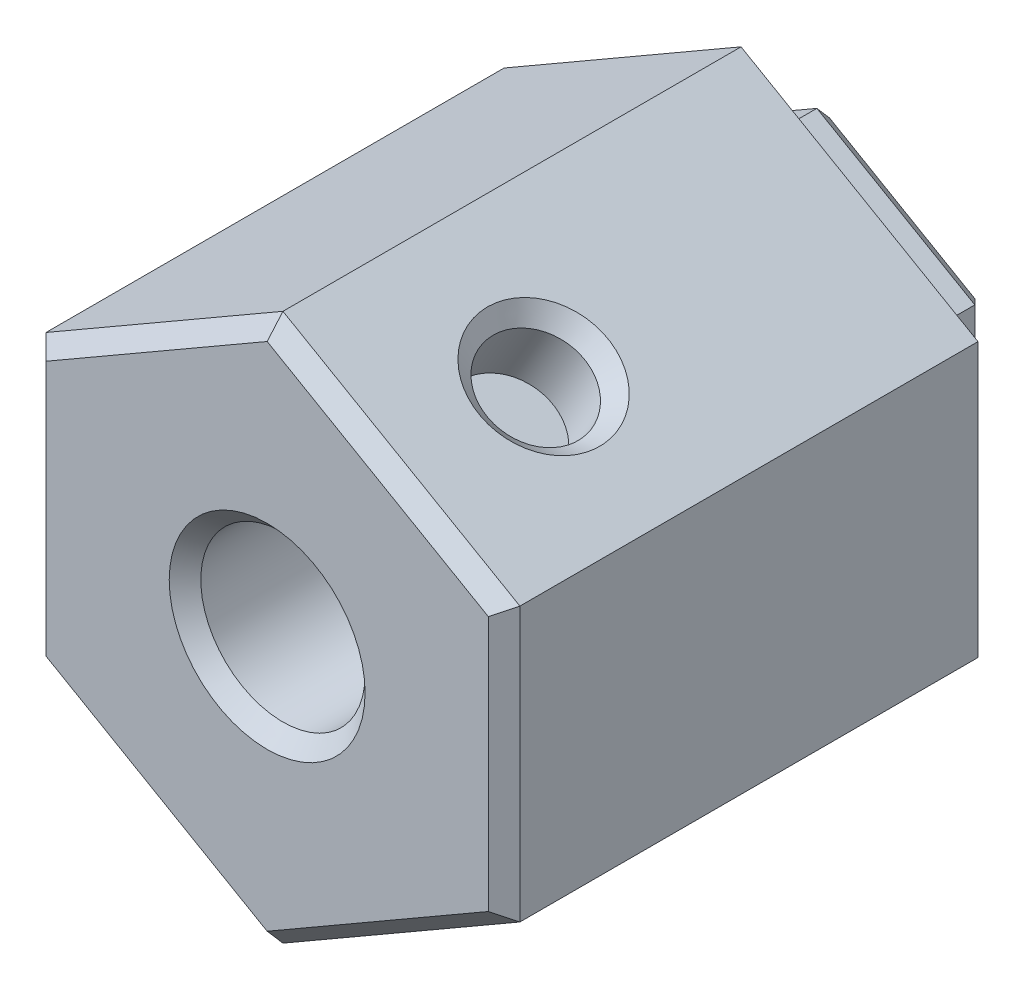
ISO-10303-21;
HEADER;
FILE_DESCRIPTION(('STEP AP214'),'2;1');
FILE_NAME('part.step','',(''),(''),'','','');
FILE_SCHEMA(('AUTOMOTIVE_DESIGN { 1 0 10303 214 1 1 1 1 }'));
ENDSEC;
DATA;
#1=APPLICATION_CONTEXT('core data for automotive mechanical design processes');
#2=APPLICATION_PROTOCOL_DEFINITION('international standard','automotive_design',2000,#1);
#3=PRODUCT_CONTEXT('',#1,'mechanical');
#4=PRODUCT('Part','Part','',(#3));
#5=PRODUCT_RELATED_PRODUCT_CATEGORY('part','',(#4));
#6=PRODUCT_DEFINITION_FORMATION('','',#4);
#7=PRODUCT_DEFINITION_CONTEXT('part definition',#1,'design');
#8=PRODUCT_DEFINITION('design','',#6,#7);
#9=PRODUCT_DEFINITION_SHAPE('','',#8);
#10=(LENGTH_UNIT() NAMED_UNIT(*) SI_UNIT(.MILLI.,.METRE.));
#11=(NAMED_UNIT(*) PLANE_ANGLE_UNIT() SI_UNIT($,.RADIAN.));
#12=(NAMED_UNIT(*) SI_UNIT($,.STERADIAN.) SOLID_ANGLE_UNIT());
#13=UNCERTAINTY_MEASURE_WITH_UNIT(LENGTH_MEASURE(1.E-05),#10,'distance_accuracy_value','');
#14=(GEOMETRIC_REPRESENTATION_CONTEXT(3) GLOBAL_UNCERTAINTY_ASSIGNED_CONTEXT((#13)) GLOBAL_UNIT_ASSIGNED_CONTEXT((#10,
#11,#12)) REPRESENTATION_CONTEXT('',''));
#15=CARTESIAN_POINT('',(0.,0.,0.));
#16=DIRECTION('',(0.,0.,1.));
#17=DIRECTION('',(1.,0.,0.));
#18=AXIS2_PLACEMENT_3D('',#15,#16,#17);
#19=CARTESIAN_POINT('',(0.,0.,0.));
#20=DIRECTION('',(0.,0.,1.));
#21=DIRECTION('',(1.,0.,0.));
#22=AXIS2_PLACEMENT_3D('',#19,#20,#21);
#23=PLANE('',#22);
#24=DIRECTION('',(-0.866025403784442,0.499999999999995,0.));
#25=VECTOR('',#24,1.);
#26=CARTESIAN_POINT('',(7.49999999999994,4.33012701892227,0.));
#27=LINE('',#26,#25);
#28=CARTESIAN_POINT('',(7.49999999999994,4.33012701892227,0.));
#29=VERTEX_POINT('',#28);
#30=CARTESIAN_POINT('',(0.,8.66025403784437,0.));
#31=VERTEX_POINT('',#30);
#32=EDGE_CURVE('E198',#29,#31,#27,.T.);
#33=ORIENTED_EDGE('',*,*,#32,.F.);
#34=DIRECTION('',(0.,1.,0.));
#35=VECTOR('',#34,1.);
#36=CARTESIAN_POINT('',(7.50000000000003,-4.33012701892212,0.));
#37=LINE('',#36,#35);
#38=CARTESIAN_POINT('',(7.50000000000003,-4.33012701892212,0.));
#39=VERTEX_POINT('',#38);
#40=EDGE_CURVE('E213',#39,#29,#37,.T.);
#41=ORIENTED_EDGE('',*,*,#40,.F.);
#42=DIRECTION('',(0.866025403784435,0.500000000000007,0.));
#43=VECTOR('',#42,1.);
#44=CARTESIAN_POINT('',(0.,-8.66025403784437,0.));
#45=LINE('',#44,#43);
#46=CARTESIAN_POINT('',(0.,-8.66025403784437,0.));
#47=VERTEX_POINT('',#46);
#48=EDGE_CURVE('E210',#47,#39,#45,.T.);
#49=ORIENTED_EDGE('',*,*,#48,.F.);
#50=DIRECTION('',(0.866025403784442,-0.499999999999995,0.));
#51=VECTOR('',#50,1.);
#52=CARTESIAN_POINT('',(-7.49999999999997,-4.33012701892222,0.));
#53=LINE('',#52,#51);
#54=CARTESIAN_POINT('',(-7.49999999999997,-4.33012701892222,0.));
#55=VERTEX_POINT('',#54);
#56=EDGE_CURVE('E207',#55,#47,#53,.T.);
#57=ORIENTED_EDGE('',*,*,#56,.F.);
#58=DIRECTION('',(0.,-1.,0.));
#59=VECTOR('',#58,1.);
#60=CARTESIAN_POINT('',(-7.5,4.33012701892217,0.));
#61=LINE('',#60,#59);
#62=CARTESIAN_POINT('',(-7.5,4.33012701892217,0.));
#63=VERTEX_POINT('',#62);
#64=EDGE_CURVE('E204',#63,#55,#61,.T.);
#65=ORIENTED_EDGE('',*,*,#64,.F.);
#66=DIRECTION('',(-0.866025403784438,-0.500000000000001,0.));
#67=VECTOR('',#66,1.);
#68=CARTESIAN_POINT('',(0.,8.66025403784437,0.));
#69=LINE('',#68,#67);
#70=EDGE_CURVE('E201',#31,#63,#69,.T.);
#71=ORIENTED_EDGE('',*,*,#70,.F.);
#72=EDGE_LOOP('',(#33,#41,#49,#57,#65,#71));
#73=FACE_BOUND('',#72,.T.);
#74=DIRECTION('',(0.866025403784439,0.5,0.));
#75=VECTOR('',#74,1.);
#76=CARTESIAN_POINT('',(-5.,2.88675134594813,0.));
#77=LINE('',#76,#75);
#78=CARTESIAN_POINT('',(-5.,2.88675134594813,0.));
#79=VERTEX_POINT('',#78);
#80=CARTESIAN_POINT('',(0.,5.77350269189626,0.));
#81=VERTEX_POINT('',#80);
#82=EDGE_CURVE('E177',#79,#81,#77,.T.);
#83=ORIENTED_EDGE('',*,*,#82,.F.);
#84=DIRECTION('',(0.,1.,0.));
#85=VECTOR('',#84,1.);
#86=CARTESIAN_POINT('',(-5.,-2.88675134594813,0.));
#87=LINE('',#86,#85);
#88=CARTESIAN_POINT('',(-5.,-2.88675134594813,0.));
#89=VERTEX_POINT('',#88);
#90=EDGE_CURVE('E187',#89,#79,#87,.T.);
#91=ORIENTED_EDGE('',*,*,#90,.F.);
#92=DIRECTION('',(-0.866025403784439,0.5,0.));
#93=VECTOR('',#92,1.);
#94=CARTESIAN_POINT('',(0.,-5.77350269189626,0.));
#95=LINE('',#94,#93);
#96=CARTESIAN_POINT('',(0.,-5.77350269189626,0.));
#97=VERTEX_POINT('',#96);
#98=EDGE_CURVE('E184',#97,#89,#95,.T.);
#99=ORIENTED_EDGE('',*,*,#98,.F.);
#100=DIRECTION('',(-0.866025403784439,-0.5,0.));
#101=VECTOR('',#100,1.);
#102=CARTESIAN_POINT('',(5.,-2.88675134594813,0.));
#103=LINE('',#102,#101);
#104=CARTESIAN_POINT('',(5.,-2.88675134594813,0.));
#105=VERTEX_POINT('',#104);
#106=EDGE_CURVE('E174',#105,#97,#103,.T.);
#107=ORIENTED_EDGE('',*,*,#106,.F.);
#108=DIRECTION('',(0.,-1.,0.));
#109=VECTOR('',#108,1.);
#110=CARTESIAN_POINT('',(5.,2.88675134594813,0.));
#111=LINE('',#110,#109);
#112=CARTESIAN_POINT('',(5.,2.88675134594813,0.));
#113=VERTEX_POINT('',#112);
#114=EDGE_CURVE('E160',#113,#105,#111,.T.);
#115=ORIENTED_EDGE('',*,*,#114,.F.);
#116=DIRECTION('',(0.866025403784439,-0.5,0.));
#117=VECTOR('',#116,1.);
#118=CARTESIAN_POINT('',(0.,5.77350269189626,0.));
#119=LINE('',#118,#117);
#120=EDGE_CURVE('E170',#81,#113,#119,.T.);
#121=ORIENTED_EDGE('',*,*,#120,.F.);
#122=EDGE_LOOP('',(#83,#91,#99,#107,#115,#121));
#123=FACE_BOUND('',#122,.T.);
#124=ADVANCED_FACE('F33',(#73,#123),#23,.F.);
#125=CARTESIAN_POINT('',(7.49999999999994,4.33012701892227,15.));
#126=DIRECTION('',(-0.499999999999995,-0.866025403784441,0.));
#127=DIRECTION('',(0.866025403784442,-0.499999999999995,0.));
#128=AXIS2_PLACEMENT_3D('',#125,#126,#127);
#129=PLANE('',#128);
#130=CARTESIAN_POINT('',(3.74999999999997,6.49519052838333,10.));
#131=DIRECTION('',(-0.499999999999995,-0.866025403784441,0.));
#132=DIRECTION('',(0.866025403784442,-0.499999999999995,0.));
#133=AXIS2_PLACEMENT_3D('',#130,#131,#132);
#134=CIRCLE('',#133,2.04999999999999);
#135=CARTESIAN_POINT('',(1.97464792224188,7.52019052838331,10.));
#136=VERTEX_POINT('',#135);
#137=EDGE_CURVE('E292',#136,#136,#134,.T.);
#138=ORIENTED_EDGE('',*,*,#137,.T.);
#139=EDGE_LOOP('',(#138));
#140=FACE_BOUND('',#139,.T.);
#141=DIRECTION('',(0.,0.,-1.));
#142=VECTOR('',#141,1.);
#143=CARTESIAN_POINT('',(0.,8.66025403784437,15.));
#144=LINE('',#143,#142);
#145=CARTESIAN_POINT('',(0.,8.66025403784437,14.5));
#146=VERTEX_POINT('',#145);
#147=EDGE_CURVE('E226',#146,#31,#144,.T.);
#148=ORIENTED_EDGE('',*,*,#147,.F.);
#149=DIRECTION('',(0.866025403784442,-0.499999999999995,0.));
#150=VECTOR('',#149,1.);
#151=CARTESIAN_POINT('',(7.49999999999994,4.33012701892227,14.5));
#152=LINE('',#151,#150);
#153=CARTESIAN_POINT('',(7.49999999999994,4.33012701892227,14.5));
#154=VERTEX_POINT('',#153);
#155=EDGE_CURVE('E255',#146,#154,#152,.T.);
#156=ORIENTED_EDGE('',*,*,#155,.T.);
#157=DIRECTION('',(0.,0.,-1.));
#158=VECTOR('',#157,1.);
#159=CARTESIAN_POINT('',(7.49999999999994,4.33012701892227,15.));
#160=LINE('',#159,#158);
#161=EDGE_CURVE('E216',#154,#29,#160,.T.);
#162=ORIENTED_EDGE('',*,*,#161,.T.);
#163=ORIENTED_EDGE('',*,*,#32,.T.);
#164=EDGE_LOOP('',(#148,#156,#162,#163));
#165=FACE_BOUND('',#164,.T.);
#166=ADVANCED_FACE('F382',(#140,#165),#129,.F.);
#167=CARTESIAN_POINT('',(0.,8.66025403784437,15.));
#168=DIRECTION('',(0.500000000000001,-0.866025403784438,0.));
#169=DIRECTION('',(0.866025403784438,0.500000000000001,0.));
#170=AXIS2_PLACEMENT_3D('',#167,#168,#169);
#171=PLANE('',#170);
#172=DIRECTION('',(0.,0.,-1.));
#173=VECTOR('',#172,1.);
#174=CARTESIAN_POINT('',(-7.5,4.33012701892217,15.));
#175=LINE('',#174,#173);
#176=CARTESIAN_POINT('',(-7.5,4.33012701892217,14.5));
#177=VERTEX_POINT('',#176);
#178=EDGE_CURVE('E224',#177,#63,#175,.T.);
#179=ORIENTED_EDGE('',*,*,#178,.F.);
#180=DIRECTION('',(0.866025403784438,0.500000000000001,0.));
#181=VECTOR('',#180,1.);
#182=CARTESIAN_POINT('',(0.,8.66025403784437,14.5));
#183=LINE('',#182,#181);
#184=EDGE_CURVE('E253',#177,#146,#183,.T.);
#185=ORIENTED_EDGE('',*,*,#184,.T.);
#186=ORIENTED_EDGE('',*,*,#147,.T.);
#187=ORIENTED_EDGE('',*,*,#70,.T.);
#188=EDGE_LOOP('',(#179,#185,#186,#187));
#189=FACE_BOUND('',#188,.T.);
#190=ADVANCED_FACE('F388',(#189),#171,.F.);
#191=CARTESIAN_POINT('',(-7.5,4.33012701892217,15.));
#192=DIRECTION('',(1.,0.,0.));
#193=DIRECTION('',(0.,1.,0.));
#194=AXIS2_PLACEMENT_3D('',#191,#192,#193);
#195=PLANE('',#194);
#196=CARTESIAN_POINT('',(-7.49999999999998,0.,10.));
#197=DIRECTION('',(1.,0.,0.));
#198=DIRECTION('',(0.,1.,0.));
#199=AXIS2_PLACEMENT_3D('',#196,#197,#198);
#200=CIRCLE('',#199,2.04999999999996);
#201=CARTESIAN_POINT('',(-7.49999999999999,2.04999999999988,10.));
#202=VERTEX_POINT('',#201);
#203=EDGE_CURVE('E280',#202,#202,#200,.T.);
#204=ORIENTED_EDGE('',*,*,#203,.T.);
#205=EDGE_LOOP('',(#204));
#206=FACE_BOUND('',#205,.T.);
#207=DIRECTION('',(0.,0.,-1.));
#208=VECTOR('',#207,1.);
#209=CARTESIAN_POINT('',(-7.49999999999997,-4.33012701892222,15.));
#210=LINE('',#209,#208);
#211=CARTESIAN_POINT('',(-7.49999999999997,-4.33012701892222,14.5));
#212=VERTEX_POINT('',#211);
#213=EDGE_CURVE('E222',#212,#55,#210,.T.);
#214=ORIENTED_EDGE('',*,*,#213,.F.);
#215=DIRECTION('',(0.,1.,0.));
#216=VECTOR('',#215,1.);
#217=CARTESIAN_POINT('',(-7.5,4.33012701892217,14.5));
#218=LINE('',#217,#216);
#219=EDGE_CURVE('E251',#212,#177,#218,.T.);
#220=ORIENTED_EDGE('',*,*,#219,.T.);
#221=ORIENTED_EDGE('',*,*,#178,.T.);
#222=ORIENTED_EDGE('',*,*,#64,.T.);
#223=EDGE_LOOP('',(#214,#220,#221,#222));
#224=FACE_BOUND('',#223,.T.);
#225=ADVANCED_FACE('F407',(#206,#224),#195,.F.);
#226=CARTESIAN_POINT('',(-7.49999999999997,-4.33012701892222,15.));
#227=DIRECTION('',(0.499999999999995,0.866025403784442,0.));
#228=DIRECTION('',(-0.866025403784442,0.499999999999995,0.));
#229=AXIS2_PLACEMENT_3D('',#226,#227,#228);
#230=PLANE('',#229);
#231=DIRECTION('',(0.,0.,-1.));
#232=VECTOR('',#231,1.);
#233=CARTESIAN_POINT('',(0.,-8.66025403784437,15.));
#234=LINE('',#233,#232);
#235=CARTESIAN_POINT('',(0.,-8.66025403784437,14.5));
#236=VERTEX_POINT('',#235);
#237=EDGE_CURVE('E220',#236,#47,#234,.T.);
#238=ORIENTED_EDGE('',*,*,#237,.F.);
#239=DIRECTION('',(-0.866025403784442,0.499999999999995,0.));
#240=VECTOR('',#239,1.);
#241=CARTESIAN_POINT('',(-7.49999999999997,-4.33012701892222,14.5));
#242=LINE('',#241,#240);
#243=EDGE_CURVE('E249',#236,#212,#242,.T.);
#244=ORIENTED_EDGE('',*,*,#243,.T.);
#245=ORIENTED_EDGE('',*,*,#213,.T.);
#246=ORIENTED_EDGE('',*,*,#56,.T.);
#247=EDGE_LOOP('',(#238,#244,#245,#246));
#248=FACE_BOUND('',#247,.T.);
#249=ADVANCED_FACE('F403',(#248),#230,.F.);
#250=CARTESIAN_POINT('',(0.,-8.66025403784437,15.));
#251=DIRECTION('',(-0.500000000000007,0.866025403784435,0.));
#252=DIRECTION('',(-0.866025403784435,-0.500000000000007,0.));
#253=AXIS2_PLACEMENT_3D('',#250,#251,#252);
#254=PLANE('',#253);
#255=CARTESIAN_POINT('',(3.75000000000009,-6.49519052838322,10.));
#256=DIRECTION('',(-0.500000000000007,0.866025403784435,0.));
#257=DIRECTION('',(-0.866025403784435,-0.500000000000007,0.));
#258=AXIS2_PLACEMENT_3D('',#255,#256,#257);
#259=CIRCLE('',#258,2.04999999999997);
#260=CARTESIAN_POINT('',(1.97464792224202,-7.52019052838322,10.));
#261=VERTEX_POINT('',#260);
#262=EDGE_CURVE('E286',#261,#261,#259,.T.);
#263=ORIENTED_EDGE('',*,*,#262,.T.);
#264=EDGE_LOOP('',(#263));
#265=FACE_BOUND('',#264,.T.);
#266=DIRECTION('',(0.,0.,-1.));
#267=VECTOR('',#266,1.);
#268=CARTESIAN_POINT('',(7.50000000000003,-4.33012701892212,15.));
#269=LINE('',#268,#267);
#270=CARTESIAN_POINT('',(7.50000000000003,-4.33012701892212,14.5));
#271=VERTEX_POINT('',#270);
#272=EDGE_CURVE('E218',#271,#39,#269,.T.);
#273=ORIENTED_EDGE('',*,*,#272,.F.);
#274=DIRECTION('',(-0.866025403784435,-0.500000000000007,0.));
#275=VECTOR('',#274,1.);
#276=CARTESIAN_POINT('',(0.,-8.66025403784437,14.5));
#277=LINE('',#276,#275);
#278=EDGE_CURVE('E247',#271,#236,#277,.T.);
#279=ORIENTED_EDGE('',*,*,#278,.T.);
#280=ORIENTED_EDGE('',*,*,#237,.T.);
#281=ORIENTED_EDGE('',*,*,#48,.T.);
#282=EDGE_LOOP('',(#273,#279,#280,#281));
#283=FACE_BOUND('',#282,.T.);
#284=ADVANCED_FACE('F399',(#265,#283),#254,.F.);
#285=CARTESIAN_POINT('',(7.50000000000003,-4.33012701892212,15.));
#286=DIRECTION('',(-1.,0.,0.));
#287=DIRECTION('',(0.,-1.,0.));
#288=AXIS2_PLACEMENT_3D('',#285,#286,#287);
#289=PLANE('',#288);
#290=ORIENTED_EDGE('',*,*,#161,.F.);
#291=DIRECTION('',(0.,-1.,0.));
#292=VECTOR('',#291,1.);
#293=CARTESIAN_POINT('',(7.50000000000003,-4.33012701892212,14.5));
#294=LINE('',#293,#292);
#295=EDGE_CURVE('E244',#154,#271,#294,.T.);
#296=ORIENTED_EDGE('',*,*,#295,.T.);
#297=ORIENTED_EDGE('',*,*,#272,.T.);
#298=ORIENTED_EDGE('',*,*,#40,.T.);
#299=EDGE_LOOP('',(#290,#296,#297,#298));
#300=FACE_BOUND('',#299,.T.);
#301=ADVANCED_FACE('F396',(#300),#289,.F.);
#302=CARTESIAN_POINT('',(0.,0.,15.));
#303=DIRECTION('',(0.,0.,1.));
#304=DIRECTION('',(1.,0.,0.));
#305=AXIS2_PLACEMENT_3D('',#302,#303,#304);
#306=PLANE('',#305);
#307=DIRECTION('',(0.866025403784435,0.500000000000007,0.));
#308=VECTOR('',#307,1.);
#309=CARTESIAN_POINT('',(7.25000000000002,-3.8971143170299,15.));
#310=LINE('',#309,#308);
#311=CARTESIAN_POINT('',(0.,-8.08290376865474,15.));
#312=VERTEX_POINT('',#311);
#313=CARTESIAN_POINT('',(7.00000000000002,-4.04145188432731,15.));
#314=VERTEX_POINT('',#313);
#315=EDGE_CURVE('E239',#312,#314,#310,.T.);
#316=ORIENTED_EDGE('',*,*,#315,.T.);
#317=DIRECTION('',(0.,1.,0.));
#318=VECTOR('',#317,1.);
#319=CARTESIAN_POINT('',(6.99999999999993,4.33012701892227,15.));
#320=LINE('',#319,#318);
#321=CARTESIAN_POINT('',(6.99999999999994,4.04145188432746,15.));
#322=VERTEX_POINT('',#321);
#323=EDGE_CURVE('E241',#314,#322,#320,.T.);
#324=ORIENTED_EDGE('',*,*,#323,.T.);
#325=DIRECTION('',(-0.866025403784442,0.499999999999995,0.));
#326=VECTOR('',#325,1.);
#327=CARTESIAN_POINT('',(-0.249999999999999,8.22724133595215,15.));
#328=LINE('',#327,#326);
#329=CARTESIAN_POINT('',(0.,8.08290376865475,15.));
#330=VERTEX_POINT('',#329);
#331=EDGE_CURVE('E231',#322,#330,#328,.T.);
#332=ORIENTED_EDGE('',*,*,#331,.T.);
#333=DIRECTION('',(-0.866025403784438,-0.500000000000001,0.));
#334=VECTOR('',#333,1.);
#335=CARTESIAN_POINT('',(-7.25,3.89711431702995,15.));
#336=LINE('',#335,#334);
#337=CARTESIAN_POINT('',(-6.99999999999999,4.04145188432735,15.));
#338=VERTEX_POINT('',#337);
#339=EDGE_CURVE('E233',#330,#338,#336,.T.);
#340=ORIENTED_EDGE('',*,*,#339,.T.);
#341=DIRECTION('',(0.,-1.,0.));
#342=VECTOR('',#341,1.);
#343=CARTESIAN_POINT('',(-6.99999999999996,-4.33012701892222,15.));
#344=LINE('',#343,#342);
#345=CARTESIAN_POINT('',(-6.99999999999997,-4.0414518843274,15.));
#346=VERTEX_POINT('',#345);
#347=EDGE_CURVE('E235',#338,#346,#344,.T.);
#348=ORIENTED_EDGE('',*,*,#347,.T.);
#349=DIRECTION('',(0.866025403784442,-0.499999999999995,0.));
#350=VECTOR('',#349,1.);
#351=CARTESIAN_POINT('',(0.25000000000006,-8.22724133595215,15.));
#352=LINE('',#351,#350);
#353=EDGE_CURVE('E237',#346,#312,#352,.T.);
#354=ORIENTED_EDGE('',*,*,#353,.T.);
#355=EDGE_LOOP('',(#316,#324,#332,#340,#348,#354));
#356=FACE_BOUND('',#355,.T.);
#357=CARTESIAN_POINT('',(0.,0.,15.));
#358=DIRECTION('',(0.,0.,1.));
#359=DIRECTION('',(1.,0.,0.));
#360=AXIS2_PLACEMENT_3D('',#357,#358,#359);
#361=CIRCLE('',#360,3.1);
#362=CARTESIAN_POINT('',(3.1,0.,15.));
#363=VERTEX_POINT('',#362);
#364=EDGE_CURVE('E228',#363,#363,#361,.F.);
#365=ORIENTED_EDGE('',*,*,#364,.T.);
#366=EDGE_LOOP('',(#365));
#367=FACE_BOUND('',#366,.T.);
#368=ADVANCED_FACE('F394',(#356,#367),#306,.T.);
#369=CARTESIAN_POINT('',(-5.,2.88675134594813,-2.8));
#370=DIRECTION('',(0.5,-0.866025403784439,0.));
#371=DIRECTION('',(0.866025403784439,0.5,0.));
#372=AXIS2_PLACEMENT_3D('',#369,#370,#371);
#373=PLANE('',#372);
#374=DIRECTION('',(0.,0.,1.));
#375=VECTOR('',#374,1.);
#376=CARTESIAN_POINT('',(0.,5.77350269189626,-2.8));
#377=LINE('',#376,#375);
#378=CARTESIAN_POINT('',(0.,5.77350269189626,-2.4));
#379=VERTEX_POINT('',#378);
#380=EDGE_CURVE('E163',#379,#81,#377,.T.);
#381=ORIENTED_EDGE('',*,*,#380,.F.);
#382=DIRECTION('',(-0.866025403784439,-0.5,0.));
#383=VECTOR('',#382,1.);
#384=CARTESIAN_POINT('',(-5.,2.88675134594813,-2.4));
#385=LINE('',#384,#383);
#386=CARTESIAN_POINT('',(-5.,2.88675134594813,-2.4));
#387=VERTEX_POINT('',#386);
#388=EDGE_CURVE('E11',#379,#387,#385,.T.);
#389=ORIENTED_EDGE('',*,*,#388,.T.);
#390=DIRECTION('',(0.,0.,1.));
#391=VECTOR('',#390,1.);
#392=CARTESIAN_POINT('',(-5.,2.88675134594813,-2.8));
#393=LINE('',#392,#391);
#394=EDGE_CURVE('E190',#387,#79,#393,.T.);
#395=ORIENTED_EDGE('',*,*,#394,.T.);
#396=ORIENTED_EDGE('',*,*,#82,.T.);
#397=EDGE_LOOP('',(#381,#389,#395,#396));
#398=FACE_BOUND('',#397,.T.);
#399=ADVANCED_FACE('F354',(#398),#373,.F.);
#400=CARTESIAN_POINT('',(0.,5.77350269189626,-2.8));
#401=DIRECTION('',(-0.5,-0.866025403784438,0.));
#402=DIRECTION('',(0.866025403784439,-0.5,0.));
#403=AXIS2_PLACEMENT_3D('',#400,#401,#402);
#404=PLANE('',#403);
#405=DIRECTION('',(0.,0.,1.));
#406=VECTOR('',#405,1.);
#407=CARTESIAN_POINT('',(5.,2.88675134594813,-2.8));
#408=LINE('',#407,#406);
#409=CARTESIAN_POINT('',(5.,2.88675134594813,-2.4));
#410=VERTEX_POINT('',#409);
#411=EDGE_CURVE('E157',#410,#113,#408,.T.);
#412=ORIENTED_EDGE('',*,*,#411,.F.);
#413=DIRECTION('',(-0.866025403784439,0.5,0.));
#414=VECTOR('',#413,1.);
#415=CARTESIAN_POINT('',(0.,5.77350269189626,-2.4));
#416=LINE('',#415,#414);
#417=EDGE_CURVE('E42',#410,#379,#416,.T.);
#418=ORIENTED_EDGE('',*,*,#417,.T.);
#419=ORIENTED_EDGE('',*,*,#380,.T.);
#420=ORIENTED_EDGE('',*,*,#120,.T.);
#421=EDGE_LOOP('',(#412,#418,#419,#420));
#422=FACE_BOUND('',#421,.T.);
#423=ADVANCED_FACE('F176',(#422),#404,.F.);
#424=CARTESIAN_POINT('',(5.,2.88675134594813,-2.8));
#425=DIRECTION('',(-1.,0.,0.));
#426=DIRECTION('',(0.,-1.,0.));
#427=AXIS2_PLACEMENT_3D('',#424,#425,#426);
#428=PLANE('',#427);
#429=DIRECTION('',(0.,0.,1.));
#430=VECTOR('',#429,1.);
#431=CARTESIAN_POINT('',(5.,-2.88675134594813,-2.8));
#432=LINE('',#431,#430);
#433=CARTESIAN_POINT('',(5.,-2.88675134594813,-2.4));
#434=VERTEX_POINT('',#433);
#435=EDGE_CURVE('E164',#434,#105,#432,.T.);
#436=ORIENTED_EDGE('',*,*,#435,.F.);
#437=DIRECTION('',(0.,1.,0.));
#438=VECTOR('',#437,1.);
#439=CARTESIAN_POINT('',(5.,2.88675134594813,-2.4));
#440=LINE('',#439,#438);
#441=EDGE_CURVE('E57',#434,#410,#440,.T.);
#442=ORIENTED_EDGE('',*,*,#441,.T.);
#443=ORIENTED_EDGE('',*,*,#411,.T.);
#444=ORIENTED_EDGE('',*,*,#114,.T.);
#445=EDGE_LOOP('',(#436,#442,#443,#444));
#446=FACE_BOUND('',#445,.T.);
#447=ADVANCED_FACE('F159',(#446),#428,.F.);
#448=CARTESIAN_POINT('',(5.,-2.88675134594813,-2.8));
#449=DIRECTION('',(-0.5,0.866025403784439,0.));
#450=DIRECTION('',(-0.866025403784439,-0.5,0.));
#451=AXIS2_PLACEMENT_3D('',#448,#449,#450);
#452=PLANE('',#451);
#453=DIRECTION('',(0.,0.,1.));
#454=VECTOR('',#453,1.);
#455=CARTESIAN_POINT('',(0.,-5.77350269189626,-2.8));
#456=LINE('',#455,#454);
#457=CARTESIAN_POINT('',(0.,-5.77350269189626,-2.4));
#458=VERTEX_POINT('',#457);
#459=EDGE_CURVE('E194',#458,#97,#456,.T.);
#460=ORIENTED_EDGE('',*,*,#459,.F.);
#461=DIRECTION('',(0.866025403784439,0.5,0.));
#462=VECTOR('',#461,1.);
#463=CARTESIAN_POINT('',(5.,-2.88675134594813,-2.4));
#464=LINE('',#463,#462);
#465=EDGE_CURVE('E319',#458,#434,#464,.T.);
#466=ORIENTED_EDGE('',*,*,#465,.T.);
#467=ORIENTED_EDGE('',*,*,#435,.T.);
#468=ORIENTED_EDGE('',*,*,#106,.T.);
#469=EDGE_LOOP('',(#460,#466,#467,#468));
#470=FACE_BOUND('',#469,.T.);
#471=ADVANCED_FACE('F372',(#470),#452,.F.);
#472=CARTESIAN_POINT('',(0.,-5.77350269189626,-2.8));
#473=DIRECTION('',(0.5,0.866025403784438,0.));
#474=DIRECTION('',(-0.866025403784439,0.5,0.));
#475=AXIS2_PLACEMENT_3D('',#472,#473,#474);
#476=PLANE('',#475);
#477=DIRECTION('',(0.,0.,1.));
#478=VECTOR('',#477,1.);
#479=CARTESIAN_POINT('',(-5.,-2.88675134594813,-2.8));
#480=LINE('',#479,#478);
#481=CARTESIAN_POINT('',(-5.,-2.88675134594813,-2.4));
#482=VERTEX_POINT('',#481);
#483=EDGE_CURVE('E192',#482,#89,#480,.T.);
#484=ORIENTED_EDGE('',*,*,#483,.F.);
#485=DIRECTION('',(0.866025403784439,-0.5,0.));
#486=VECTOR('',#485,1.);
#487=CARTESIAN_POINT('',(0.,-5.77350269189626,-2.4));
#488=LINE('',#487,#486);
#489=EDGE_CURVE('E317',#482,#458,#488,.T.);
#490=ORIENTED_EDGE('',*,*,#489,.T.);
#491=ORIENTED_EDGE('',*,*,#459,.T.);
#492=ORIENTED_EDGE('',*,*,#98,.T.);
#493=EDGE_LOOP('',(#484,#490,#491,#492));
#494=FACE_BOUND('',#493,.T.);
#495=ADVANCED_FACE('F370',(#494),#476,.F.);
#496=CARTESIAN_POINT('',(-5.,-2.88675134594813,-2.8));
#497=DIRECTION('',(1.,0.,0.));
#498=DIRECTION('',(0.,1.,0.));
#499=AXIS2_PLACEMENT_3D('',#496,#497,#498);
#500=PLANE('',#499);
#501=ORIENTED_EDGE('',*,*,#394,.F.);
#502=DIRECTION('',(0.,-1.,0.));
#503=VECTOR('',#502,1.);
#504=CARTESIAN_POINT('',(-5.,-2.88675134594813,-2.4));
#505=LINE('',#504,#503);
#506=EDGE_CURVE('E314',#387,#482,#505,.T.);
#507=ORIENTED_EDGE('',*,*,#506,.T.);
#508=ORIENTED_EDGE('',*,*,#483,.T.);
#509=ORIENTED_EDGE('',*,*,#90,.T.);
#510=EDGE_LOOP('',(#501,#507,#508,#509));
#511=FACE_BOUND('',#510,.T.);
#512=ADVANCED_FACE('F357',(#511),#500,.F.);
#513=CARTESIAN_POINT('',(0.,0.,-2.8));
#514=DIRECTION('',(0.,0.,-1.));
#515=DIRECTION('',(-1.,0.,0.));
#516=AXIS2_PLACEMENT_3D('',#513,#514,#515);
#517=PLANE('',#516);
#518=DIRECTION('',(-0.866025403784439,0.5,0.));
#519=VECTOR('',#518,1.);
#520=CARTESIAN_POINT('',(-4.8,-2.54034118443435,-2.8));
#521=LINE('',#520,#519);
#522=CARTESIAN_POINT('',(0.,-5.31162247654456,-2.8));
#523=VERTEX_POINT('',#522);
#524=CARTESIAN_POINT('',(-4.6,-2.65581123827228,-2.8));
#525=VERTEX_POINT('',#524);
#526=EDGE_CURVE('E309',#523,#525,#521,.T.);
#527=ORIENTED_EDGE('',*,*,#526,.T.);
#528=DIRECTION('',(0.,1.,0.));
#529=VECTOR('',#528,1.);
#530=CARTESIAN_POINT('',(-4.6,2.88675134594813,-2.8));
#531=LINE('',#530,#529);
#532=CARTESIAN_POINT('',(-4.6,2.65581123827228,-2.8));
#533=VERTEX_POINT('',#532);
#534=EDGE_CURVE('E311',#525,#533,#531,.T.);
#535=ORIENTED_EDGE('',*,*,#534,.T.);
#536=DIRECTION('',(0.866025403784439,0.5,0.));
#537=VECTOR('',#536,1.);
#538=CARTESIAN_POINT('',(0.200000000000003,5.42709253038248,-2.8));
#539=LINE('',#538,#537);
#540=CARTESIAN_POINT('',(0.,5.31162247654455,-2.8));
#541=VERTEX_POINT('',#540);
#542=EDGE_CURVE('E301',#533,#541,#539,.T.);
#543=ORIENTED_EDGE('',*,*,#542,.T.);
#544=DIRECTION('',(0.866025403784439,-0.5,0.));
#545=VECTOR('',#544,1.);
#546=CARTESIAN_POINT('',(4.8,2.54034118443435,-2.8));
#547=LINE('',#546,#545);
#548=CARTESIAN_POINT('',(4.6,2.65581123827228,-2.8));
#549=VERTEX_POINT('',#548);
#550=EDGE_CURVE('E303',#541,#549,#547,.T.);
#551=ORIENTED_EDGE('',*,*,#550,.T.);
#552=DIRECTION('',(0.,-1.,0.));
#553=VECTOR('',#552,1.);
#554=CARTESIAN_POINT('',(4.6,-2.88675134594813,-2.8));
#555=LINE('',#554,#553);
#556=CARTESIAN_POINT('',(4.6,-2.65581123827228,-2.8));
#557=VERTEX_POINT('',#556);
#558=EDGE_CURVE('E305',#549,#557,#555,.T.);
#559=ORIENTED_EDGE('',*,*,#558,.T.);
#560=DIRECTION('',(-0.866025403784439,-0.5,0.));
#561=VECTOR('',#560,1.);
#562=CARTESIAN_POINT('',(-0.200000000000003,-5.42709253038248,-2.8));
#563=LINE('',#562,#561);
#564=EDGE_CURVE('E307',#557,#523,#563,.T.);
#565=ORIENTED_EDGE('',*,*,#564,.T.);
#566=EDGE_LOOP('',(#527,#535,#543,#551,#559,#565));
#567=FACE_BOUND('',#566,.T.);
#568=CARTESIAN_POINT('',(0.,0.,-2.8));
#569=DIRECTION('',(0.,0.,-1.));
#570=DIRECTION('',(-1.,0.,0.));
#571=AXIS2_PLACEMENT_3D('',#568,#569,#570);
#572=CIRCLE('',#571,3.6);
#573=CARTESIAN_POINT('',(-3.6,0.,-2.8));
#574=VERTEX_POINT('',#573);
#575=EDGE_CURVE('E295',#574,#574,#572,.F.);
#576=ORIENTED_EDGE('',*,*,#575,.T.);
#577=EDGE_LOOP('',(#576));
#578=FACE_BOUND('',#577,.T.);
#579=ADVANCED_FACE('F577',(#567,#578),#517,.T.);
#580=CARTESIAN_POINT('',(0.,0.,-2.8));
#581=DIRECTION('',(0.,0.,1.));
#582=DIRECTION('',(1.,0.,0.));
#583=AXIS2_PLACEMENT_3D('',#580,#581,#582);
#584=CYLINDRICAL_SURFACE('',#583,2.6);
#585=CARTESIAN_POINT('',(0.,0.,-1.8));
#586=DIRECTION('',(0.,0.,-1.));
#587=DIRECTION('',(-1.,0.,0.));
#588=AXIS2_PLACEMENT_3D('',#585,#586,#587);
#589=CIRCLE('',#588,2.6);
#590=CARTESIAN_POINT('',(-2.6,0.,-1.8));
#591=VERTEX_POINT('',#590);
#592=EDGE_CURVE('E298',#591,#591,#589,.T.);
#593=ORIENTED_EDGE('',*,*,#592,.T.);
#594=EDGE_LOOP('',(#593));
#595=FACE_BOUND('',#594,.T.);
#596=CARTESIAN_POINT('',(0.,0.,14.5));
#597=DIRECTION('',(0.,0.,1.));
#598=DIRECTION('',(1.,0.,0.));
#599=AXIS2_PLACEMENT_3D('',#596,#597,#598);
#600=CIRCLE('',#599,2.6);
#601=CARTESIAN_POINT('',(2.6,0.,14.5));
#602=VERTEX_POINT('',#601);
#603=EDGE_CURVE('E257',#602,#602,#600,.T.);
#604=ORIENTED_EDGE('',*,*,#603,.T.);
#605=EDGE_LOOP('',(#604));
#606=FACE_BOUND('',#605,.T.);
#607=ADVANCED_FACE('F569',(#595,#606),#584,.F.);
#608=CARTESIAN_POINT('',(2.49999999999998,4.33012701892222,10.));
#609=DIRECTION('',(0.499999999999995,0.866025403784442,0.));
#610=DIRECTION('',(-0.866025403784442,0.499999999999995,0.));
#611=AXIS2_PLACEMENT_3D('',#608,#609,#610);
#612=CYLINDRICAL_SURFACE('',#611,1.55);
#613=CARTESIAN_POINT('',(3.49999999999998,6.06217782649112,10.));
#614=DIRECTION('',(-0.499999999999995,-0.866025403784441,0.));
#615=DIRECTION('',(0.866025403784442,-0.499999999999995,0.));
#616=AXIS2_PLACEMENT_3D('',#613,#614,#615);
#617=CIRCLE('',#616,1.55);
#618=CARTESIAN_POINT('',(2.1576606241341,6.83717782649111,10.));
#619=VERTEX_POINT('',#618);
#620=EDGE_CURVE('E289',#619,#619,#617,.F.);
#621=ORIENTED_EDGE('',*,*,#620,.T.);
#622=EDGE_LOOP('',(#621));
#623=FACE_BOUND('',#622,.T.);
#624=CARTESIAN_POINT('',(2.49999999999998,4.33012701892222,10.));
#625=DIRECTION('',(0.499999999999995,0.866025403784442,0.));
#626=DIRECTION('',(-0.866025403784442,0.499999999999995,0.));
#627=AXIS2_PLACEMENT_3D('',#624,#625,#626);
#628=CIRCLE('',#627,1.55);
#629=CARTESIAN_POINT('',(1.1576606241341,5.10512701892221,10.));
#630=VERTEX_POINT('',#629);
#631=EDGE_CURVE('E179',#630,#630,#628,.T.);
#632=ORIENTED_EDGE('',*,*,#631,.F.);
#633=EDGE_LOOP('',(#632));
#634=FACE_BOUND('',#633,.T.);
#635=ADVANCED_FACE('F562',(#623,#634),#612,.F.);
#636=CARTESIAN_POINT('',(2.49999999999998,4.33012701892222,10.));
#637=DIRECTION('',(0.499999999999995,0.866025403784442,0.));
#638=DIRECTION('',(-0.866025403784442,0.499999999999995,0.));
#639=AXIS2_PLACEMENT_3D('',#636,#637,#638);
#640=PLANE('',#639);
#641=ORIENTED_EDGE('',*,*,#631,.T.);
#642=EDGE_LOOP('',(#641));
#643=FACE_BOUND('',#642,.T.);
#644=ADVANCED_FACE('F554',(#643),#640,.T.);
#645=CARTESIAN_POINT('',(2.50000000000007,-4.33012701892217,10.));
#646=DIRECTION('',(0.500000000000013,-0.866025403784431,0.));
#647=DIRECTION('',(0.866025403784431,0.500000000000013,0.));
#648=AXIS2_PLACEMENT_3D('',#645,#646,#647);
#649=CYLINDRICAL_SURFACE('',#648,1.55);
#650=CARTESIAN_POINT('',(3.50000000000011,-6.06217782649105,10.));
#651=DIRECTION('',(-0.500000000000013,0.866025403784431,0.));
#652=DIRECTION('',(-0.866025403784431,-0.500000000000013,0.));
#653=AXIS2_PLACEMENT_3D('',#650,#651,#652);
#654=CIRCLE('',#653,1.55);
#655=CARTESIAN_POINT('',(2.15766062413424,-6.83717782649107,10.));
#656=VERTEX_POINT('',#655);
#657=EDGE_CURVE('E283',#656,#656,#654,.F.);
#658=ORIENTED_EDGE('',*,*,#657,.T.);
#659=EDGE_LOOP('',(#658));
#660=FACE_BOUND('',#659,.T.);
#661=CARTESIAN_POINT('',(2.50000000000007,-4.33012701892217,10.));
#662=DIRECTION('',(0.500000000000013,-0.866025403784431,0.));
#663=DIRECTION('',(0.866025403784431,0.500000000000013,0.));
#664=AXIS2_PLACEMENT_3D('',#661,#662,#663);
#665=CIRCLE('',#664,1.55);
#666=CARTESIAN_POINT('',(3.84233937586594,-3.55512701892215,10.));
#667=VERTEX_POINT('',#666);
#668=EDGE_CURVE('E277',#667,#667,#665,.T.);
#669=ORIENTED_EDGE('',*,*,#668,.F.);
#670=EDGE_LOOP('',(#669));
#671=FACE_BOUND('',#670,.T.);
#672=ADVANCED_FACE('F546',(#660,#671),#649,.F.);
#673=CARTESIAN_POINT('',(2.50000000000007,-4.33012701892217,10.));
#674=DIRECTION('',(0.500000000000013,-0.866025403784431,0.));
#675=DIRECTION('',(0.866025403784431,0.500000000000013,0.));
#676=AXIS2_PLACEMENT_3D('',#673,#674,#675);
#677=PLANE('',#676);
#678=ORIENTED_EDGE('',*,*,#668,.T.);
#679=EDGE_LOOP('',(#678));
#680=FACE_BOUND('',#679,.T.);
#681=ADVANCED_FACE('F538',(#680),#677,.T.);
#682=CARTESIAN_POINT('',(-5.00000000000002,0.,10.));
#683=DIRECTION('',(-1.,0.,0.));
#684=DIRECTION('',(0.,-1.,0.));
#685=AXIS2_PLACEMENT_3D('',#682,#683,#684);
#686=CYLINDRICAL_SURFACE('',#685,1.55);
#687=CARTESIAN_POINT('',(-7.00000000000004,0.,10.));
#688=DIRECTION('',(1.,0.,0.));
#689=DIRECTION('',(0.,1.,0.));
#690=AXIS2_PLACEMENT_3D('',#687,#688,#689);
#691=CIRCLE('',#690,1.55);
#692=CARTESIAN_POINT('',(-7.00000000000006,1.54999999999993,10.));
#693=VERTEX_POINT('',#692);
#694=EDGE_CURVE('E260',#693,#693,#691,.F.);
#695=ORIENTED_EDGE('',*,*,#694,.T.);
#696=EDGE_LOOP('',(#695));
#697=FACE_BOUND('',#696,.T.);
#698=CARTESIAN_POINT('',(-5.00000000000002,0.,10.));
#699=DIRECTION('',(-1.,0.,0.));
#700=DIRECTION('',(0.,-1.,0.));
#701=AXIS2_PLACEMENT_3D('',#698,#699,#700);
#702=CIRCLE('',#701,1.55);
#703=CARTESIAN_POINT('',(-5.,-1.55000000000005,10.));
#704=VERTEX_POINT('',#703);
#705=EDGE_CURVE('E782',#704,#704,#702,.T.);
#706=ORIENTED_EDGE('',*,*,#705,.F.);
#707=EDGE_LOOP('',(#706));
#708=FACE_BOUND('',#707,.T.);
#709=ADVANCED_FACE('F529',(#697,#708),#686,.F.);
#710=CARTESIAN_POINT('',(-5.00000000000002,0.,10.));
#711=DIRECTION('',(-1.,0.,0.));
#712=DIRECTION('',(0.,-1.,0.));
#713=AXIS2_PLACEMENT_3D('',#710,#711,#712);
#714=PLANE('',#713);
#715=ORIENTED_EDGE('',*,*,#705,.T.);
#716=EDGE_LOOP('',(#715));
#717=FACE_BOUND('',#716,.T.);
#718=ADVANCED_FACE('F439',(#717),#714,.T.);
#719=CARTESIAN_POINT('',(-6.99999999999998,0.,15.));
#720=DIRECTION('',(-0.707106781186549,0.,0.707106781186546));
#721=DIRECTION('',(0.,1.,0.));
#722=AXIS2_PLACEMENT_3D('',#719,#720,#721);
#723=PLANE('',#722);
#724=DIRECTION('',(0.654653670707977,-0.377964473009225,0.654653670707979));
#725=VECTOR('',#724,1.);
#726=CARTESIAN_POINT('',(-5.99999999999999,3.46410161513773,16.));
#727=LINE('',#726,#725);
#728=EDGE_CURVE('E271',#177,#338,#727,.T.);
#729=ORIENTED_EDGE('',*,*,#728,.F.);
#730=ORIENTED_EDGE('',*,*,#219,.F.);
#731=DIRECTION('',(0.654653670707974,0.377964473009228,0.654653670707979));
#732=VECTOR('',#731,1.);
#733=CARTESIAN_POINT('',(-5.99999999999997,-3.46410161513778,16.));
#734=LINE('',#733,#732);
#735=EDGE_CURVE('E274',#346,#212,#734,.F.);
#736=ORIENTED_EDGE('',*,*,#735,.F.);
#737=ORIENTED_EDGE('',*,*,#347,.F.);
#738=EDGE_LOOP('',(#729,#730,#736,#737));
#739=FACE_BOUND('',#738,.T.);
#740=ADVANCED_FACE('F435',(#739),#723,.T.);
#741=CARTESIAN_POINT('',(-3.49999999999996,-6.06217782649107,15.));
#742=DIRECTION('',(-0.353553390593271,-0.612372435695799,0.707106781186545));
#743=DIRECTION('',(-0.866025403784442,0.499999999999995,0.));
#744=AXIS2_PLACEMENT_3D('',#741,#742,#743);
#745=PLANE('',#744);
#746=ORIENTED_EDGE('',*,*,#735,.T.);
#747=ORIENTED_EDGE('',*,*,#243,.F.);
#748=DIRECTION('',(0.,0.755928946018453,0.654653670707979));
#749=VECTOR('',#748,1.);
#750=CARTESIAN_POINT('',(0.,-6.92820323027549,16.));
#751=LINE('',#750,#749);
#752=EDGE_CURVE('E268',#312,#236,#751,.F.);
#753=ORIENTED_EDGE('',*,*,#752,.F.);
#754=ORIENTED_EDGE('',*,*,#353,.F.);
#755=EDGE_LOOP('',(#746,#747,#753,#754));
#756=FACE_BOUND('',#755,.T.);
#757=ADVANCED_FACE('F431',(#756),#745,.T.);
#758=CARTESIAN_POINT('',(-3.5,6.06217782649105,15.));
#759=DIRECTION('',(-0.353553390593276,0.612372435695796,0.707106781186545));
#760=DIRECTION('',(0.866025403784438,0.500000000000001,0.));
#761=AXIS2_PLACEMENT_3D('',#758,#759,#760);
#762=PLANE('',#761);
#763=ORIENTED_EDGE('',*,*,#728,.T.);
#764=ORIENTED_EDGE('',*,*,#339,.F.);
#765=DIRECTION('',(0.,-0.755928946018452,0.65465367070798));
#766=VECTOR('',#765,1.);
#767=CARTESIAN_POINT('',(0.,6.92820323027552,16.));
#768=LINE('',#767,#766);
#769=EDGE_CURVE('E265',#146,#330,#768,.T.);
#770=ORIENTED_EDGE('',*,*,#769,.F.);
#771=ORIENTED_EDGE('',*,*,#184,.F.);
#772=EDGE_LOOP('',(#763,#764,#770,#771));
#773=FACE_BOUND('',#772,.T.);
#774=ADVANCED_FACE('F427',(#773),#762,.T.);
#775=CARTESIAN_POINT('',(3.50000000000004,-6.06217782649103,15.));
#776=DIRECTION('',(0.35355339059328,-0.612372435695793,0.707106781186545));
#777=DIRECTION('',(-0.866025403784435,-0.500000000000007,0.));
#778=AXIS2_PLACEMENT_3D('',#775,#776,#777);
#779=PLANE('',#778);
#780=ORIENTED_EDGE('',*,*,#752,.T.);
#781=ORIENTED_EDGE('',*,*,#278,.F.);
#782=DIRECTION('',(-0.65465367070798,0.37796447300922,0.654653670707979));
#783=VECTOR('',#782,1.);
#784=CARTESIAN_POINT('',(6.00000000000002,-3.46410161513769,16.));
#785=LINE('',#784,#783);
#786=EDGE_CURVE('E263',#314,#271,#785,.F.);
#787=ORIENTED_EDGE('',*,*,#786,.F.);
#788=ORIENTED_EDGE('',*,*,#315,.F.);
#789=EDGE_LOOP('',(#780,#781,#787,#788));
#790=FACE_BOUND('',#789,.T.);
#791=ADVANCED_FACE('F423',(#790),#779,.T.);
#792=CARTESIAN_POINT('',(3.49999999999997,6.0621778264911,15.));
#793=DIRECTION('',(0.353553390593272,0.612372435695799,0.707106781186545));
#794=DIRECTION('',(0.866025403784442,-0.499999999999995,0.));
#795=AXIS2_PLACEMENT_3D('',#792,#793,#794);
#796=PLANE('',#795);
#797=ORIENTED_EDGE('',*,*,#769,.T.);
#798=ORIENTED_EDGE('',*,*,#331,.F.);
#799=DIRECTION('',(0.654653670707973,0.37796447300923,-0.65465367070798));
#800=VECTOR('',#799,1.);
#801=CARTESIAN_POINT('',(5.99999999999996,3.46410161513784,16.));
#802=LINE('',#801,#800);
#803=EDGE_CURVE('E261',#154,#322,#802,.F.);
#804=ORIENTED_EDGE('',*,*,#803,.F.);
#805=ORIENTED_EDGE('',*,*,#155,.F.);
#806=EDGE_LOOP('',(#797,#798,#804,#805));
#807=FACE_BOUND('',#806,.T.);
#808=ADVANCED_FACE('F419',(#807),#796,.T.);
#809=CARTESIAN_POINT('',(6.99999999999998,0.,15.));
#810=DIRECTION('',(0.707106781186549,0.,0.707106781186546));
#811=DIRECTION('',(0.,-1.,0.));
#812=AXIS2_PLACEMENT_3D('',#809,#810,#811);
#813=PLANE('',#812);
#814=ORIENTED_EDGE('',*,*,#786,.T.);
#815=ORIENTED_EDGE('',*,*,#295,.F.);
#816=ORIENTED_EDGE('',*,*,#803,.T.);
#817=ORIENTED_EDGE('',*,*,#323,.F.);
#818=EDGE_LOOP('',(#814,#815,#816,#817));
#819=FACE_BOUND('',#818,.T.);
#820=ADVANCED_FACE('F415',(#819),#813,.T.);
#821=CARTESIAN_POINT('',(0.,0.,14.5));
#822=DIRECTION('',(0.,0.,1.));
#823=DIRECTION('',(1.,0.,0.));
#824=AXIS2_PLACEMENT_3D('',#821,#822,#823);
#825=CONICAL_SURFACE('',#824,2.6,0.78539816339745);
#826=ORIENTED_EDGE('',*,*,#364,.F.);
#827=EDGE_LOOP('',(#826));
#828=FACE_BOUND('',#827,.T.);
#829=ORIENTED_EDGE('',*,*,#603,.F.);
#830=EDGE_LOOP('',(#829));
#831=FACE_BOUND('',#830,.T.);
#832=ADVANCED_FACE('F418',(#828,#831),#825,.F.);
#833=CARTESIAN_POINT('',(-7.00000000000004,0.,10.));
#834=DIRECTION('',(-1.,0.,0.));
#835=DIRECTION('',(0.,-1.,0.));
#836=AXIS2_PLACEMENT_3D('',#833,#834,#835);
#837=CONICAL_SURFACE('',#836,1.55,0.78539816339745);
#838=ORIENTED_EDGE('',*,*,#203,.F.);
#839=EDGE_LOOP('',(#838));
#840=FACE_BOUND('',#839,.T.);
#841=ORIENTED_EDGE('',*,*,#694,.F.);
#842=EDGE_LOOP('',(#841));
#843=FACE_BOUND('',#842,.T.);
#844=ADVANCED_FACE('F443',(#840,#843),#837,.F.);
#845=CARTESIAN_POINT('',(3.50000000000011,-6.06217782649105,10.));
#846=DIRECTION('',(0.500000000000013,-0.866025403784431,0.));
#847=DIRECTION('',(0.866025403784431,0.500000000000013,0.));
#848=AXIS2_PLACEMENT_3D('',#845,#846,#847);
#849=CONICAL_SURFACE('',#848,1.55,0.785398163397455);
#850=ORIENTED_EDGE('',*,*,#262,.F.);
#851=EDGE_LOOP('',(#850));
#852=FACE_BOUND('',#851,.T.);
#853=ORIENTED_EDGE('',*,*,#657,.F.);
#854=EDGE_LOOP('',(#853));
#855=FACE_BOUND('',#854,.T.);
#856=ADVANCED_FACE('F447',(#852,#855),#849,.F.);
#857=CARTESIAN_POINT('',(3.49999999999998,6.06217782649112,10.));
#858=DIRECTION('',(0.499999999999995,0.866025403784441,0.));
#859=DIRECTION('',(-0.866025403784442,0.499999999999995,0.));
#860=AXIS2_PLACEMENT_3D('',#857,#858,#859);
#861=CONICAL_SURFACE('',#860,1.55,0.785398163397451);
#862=CARTESIAN_POINT('',(1.97464792224188,7.52019052838331,10.));
#863=CARTESIAN_POINT('',(1.97655430455325,7.5130758127386,10.));
#864=CARTESIAN_POINT('',(1.97846068686463,7.50596109709389,10.));
#865=CARTESIAN_POINT('',(1.98227345148738,7.49173166580447,10.));
#866=CARTESIAN_POINT('',(1.98417983379876,7.48461695015976,10.));
#867=CARTESIAN_POINT('',(1.98799259842152,7.47038751887034,10.));
#868=CARTESIAN_POINT('',(1.98989898073289,7.46327280322563,10.));
#869=CARTESIAN_POINT('',(1.99371174535565,7.44904337193621,10.));
#870=CARTESIAN_POINT('',(1.99561812766703,7.44192865629149,10.));
#871=CARTESIAN_POINT('',(1.99943089228978,7.42769922500207,10.));
#872=CARTESIAN_POINT('',(2.00133727460116,7.42058450935736,10.));
#873=CARTESIAN_POINT('',(2.00515003922391,7.40635507806794,10.));
#874=CARTESIAN_POINT('',(2.00705642153529,7.39924036242323,10.));
#875=CARTESIAN_POINT('',(2.01086918615804,7.38501093113381,10.));
#876=CARTESIAN_POINT('',(2.01277556846942,7.3778962154891,10.));
#877=CARTESIAN_POINT('',(2.01658833309218,7.36366678419968,10.));
#878=CARTESIAN_POINT('',(2.01849471540355,7.35655206855497,10.));
#879=CARTESIAN_POINT('',(2.02230748002631,7.34232263726555,10.));
#880=CARTESIAN_POINT('',(2.02421386233769,7.33520792162084,10.));
#881=CARTESIAN_POINT('',(2.02802662696044,7.32097849033142,10.));
#882=CARTESIAN_POINT('',(2.02993300927182,7.31386377468671,10.));
#883=CARTESIAN_POINT('',(2.03374577389457,7.29963434339729,10.));
#884=CARTESIAN_POINT('',(2.03565215620595,7.29251962775258,10.));
#885=CARTESIAN_POINT('',(2.0394649208287,7.27829019646316,10.));
#886=CARTESIAN_POINT('',(2.04137130314008,7.27117548081844,10.));
#887=CARTESIAN_POINT('',(2.04518406776284,7.25694604952902,10.));
#888=CARTESIAN_POINT('',(2.04709045007421,7.24983133388431,10.));
#889=CARTESIAN_POINT('',(2.05090321469697,7.23560190259489,10.));
#890=CARTESIAN_POINT('',(2.05280959700834,7.22848718695018,10.));
#891=CARTESIAN_POINT('',(2.0566223616311,7.21425775566076,10.));
#892=CARTESIAN_POINT('',(2.05852874394248,7.20714304001605,10.));
#893=CARTESIAN_POINT('',(2.06234150856523,7.19291360872663,10.));
#894=CARTESIAN_POINT('',(2.06424789087661,7.18579889308192,10.));
#895=CARTESIAN_POINT('',(2.06806065549936,7.1715694617925,10.));
#896=CARTESIAN_POINT('',(2.06996703781074,7.16445474614779,10.));
#897=CARTESIAN_POINT('',(2.0737798024335,7.15022531485837,10.));
#898=CARTESIAN_POINT('',(2.07568618474487,7.14311059921366,10.));
#899=CARTESIAN_POINT('',(2.07949894936763,7.12888116792424,10.));
#900=CARTESIAN_POINT('',(2.081405331679,7.12176645227953,10.));
#901=CARTESIAN_POINT('',(2.08521809630176,7.10753702099011,10.));
#902=CARTESIAN_POINT('',(2.08712447861314,7.1004223053454,10.));
#903=CARTESIAN_POINT('',(2.09093724323589,7.08619287405597,10.));
#904=CARTESIAN_POINT('',(2.09284362554727,7.07907815841126,10.));
#905=CARTESIAN_POINT('',(2.09665639017002,7.06484872712184,10.));
#906=CARTESIAN_POINT('',(2.0985627724814,7.05773401147713,10.));
#907=CARTESIAN_POINT('',(2.10237553710415,7.04350458018771,10.));
#908=CARTESIAN_POINT('',(2.10428191941553,7.036389864543,10.));
#909=CARTESIAN_POINT('',(2.10809468403829,7.02216043325358,10.));
#910=CARTESIAN_POINT('',(2.11000106634966,7.01504571760887,10.));
#911=CARTESIAN_POINT('',(2.11381383097242,7.00081628631945,10.));
#912=CARTESIAN_POINT('',(2.11572021328379,6.99370157067474,10.));
#913=CARTESIAN_POINT('',(2.11953297790655,6.97947213938532,10.));
#914=CARTESIAN_POINT('',(2.12143936021793,6.97235742374061,10.));
#915=CARTESIAN_POINT('',(2.12525212484068,6.95812799245119,10.));
#916=CARTESIAN_POINT('',(2.12715850715206,6.95101327680648,10.));
#917=CARTESIAN_POINT('',(2.13097127177481,6.93678384551706,10.));
#918=CARTESIAN_POINT('',(2.13287765408619,6.92966912987235,10.));
#919=CARTESIAN_POINT('',(2.13669041870895,6.91543969858292,10.));
#920=CARTESIAN_POINT('',(2.13859680102032,6.90832498293821,10.));
#921=CARTESIAN_POINT('',(2.14240956564308,6.89409555164879,10.));
#922=CARTESIAN_POINT('',(2.14431594795445,6.88698083600408,10.));
#923=CARTESIAN_POINT('',(2.14812871257721,6.87275140471466,10.));
#924=CARTESIAN_POINT('',(2.15003509488859,6.86563668906995,10.));
#925=CARTESIAN_POINT('',(2.15384785951134,6.85140725778053,10.));
#926=CARTESIAN_POINT('',(2.15575424182272,6.84429254213582,10.));
#927=CARTESIAN_POINT('',(2.1576606241341,6.83717782649111,10.));
#928=B_SPLINE_CURVE_WITH_KNOTS('',3,(#862,#863,#864,#865,#866,#867,#868,#869,#870,#871,#872,
#873,#874,#875,#876,#877,#878,#879,#880,#881,#882,#883,#884,#885,#886,#887,#888,#889,#890,#891,
#892,#893,#894,#895,#896,#897,#898,#899,#900,#901,#902,#903,#904,#905,#906,#907,#908,#909,#910,
#911,#912,#913,#914,#915,#916,#917,#918,#919,#920,#921,#922,#923,#924,#925,#926,#927),
.UNSPECIFIED.,.F.,.F.,(4,2,2,2,2,2,2,2,2,2,2,2,2,2,2,2,2,2,2,2,2,2,2,2,2,2,2,2,2,2,2,2,4),(0.,
0.0220970869120795,0.0441941738241576,0.0662912607362373,0.0883883476483161,0.110485434560395,
0.132582521472474,0.154679608384553,0.176776695296631,0.198873782208711,0.22097086912079,
0.243067956032869,0.265165042944948,0.287262129857027,0.309359216769105,0.331456303681185,
0.353553390593264,0.375650477505342,0.397747564417422,0.4198446513295,0.441941738241579,
0.464038825153658,0.486135912065738,0.508232998977816,0.530330085889895,0.552427172801974,
0.574524259714053,0.596621346626132,0.618718433538212,0.64081552045029,0.662912607362369,
0.685009694274449,0.707106781186527),.UNSPECIFIED.);
#929=EDGE_CURVE('BSEAM451',#136,#619,#928,.T.);
#930=ORIENTED_EDGE('',*,*,#137,.F.);
#931=ORIENTED_EDGE('',*,*,#620,.F.);
#932=ORIENTED_EDGE('',*,*,#929,.T.);
#933=ORIENTED_EDGE('',*,*,#929,.F.);
#934=EDGE_LOOP('',(#930,#932,#931,#933));
#935=FACE_BOUND('',#934,.T.);
#936=ADVANCED_FACE('F451',(#935),#861,.F.);
#937=CARTESIAN_POINT('',(0.,0.,-2.8));
#938=DIRECTION('',(0.,0.,-1.));
#939=DIRECTION('',(-1.,0.,0.));
#940=AXIS2_PLACEMENT_3D('',#937,#938,#939);
#941=CONICAL_SURFACE('',#940,3.6,0.785398163397444);
#942=ORIENTED_EDGE('',*,*,#592,.F.);
#943=EDGE_LOOP('',(#942));
#944=FACE_BOUND('',#943,.T.);
#945=ORIENTED_EDGE('',*,*,#575,.F.);
#946=EDGE_LOOP('',(#945));
#947=FACE_BOUND('',#946,.T.);
#948=ADVANCED_FACE('F455',(#944,#947),#941,.F.);
#949=CARTESIAN_POINT('',(4.6,0.,-2.8));
#950=DIRECTION('',(0.707106781186544,0.,-0.707106781186551));
#951=DIRECTION('',(0.,1.,0.));
#952=AXIS2_PLACEMENT_3D('',#949,#950,#951);
#953=PLANE('',#952);
#954=DIRECTION('',(-0.65465367070798,-0.377964473009229,-0.654653670707974));
#955=VECTOR('',#954,1.);
#956=CARTESIAN_POINT('',(3.94285714285714,2.27640963280481,-3.45714285714286));
#957=LINE('',#956,#955);
#958=EDGE_CURVE('E332',#410,#549,#957,.T.);
#959=ORIENTED_EDGE('',*,*,#958,.F.);
#960=ORIENTED_EDGE('',*,*,#441,.F.);
#961=DIRECTION('',(-0.65465367070798,0.377964473009227,-0.654653670707975));
#962=VECTOR('',#961,1.);
#963=CARTESIAN_POINT('',(3.94285714285714,-2.27640963280481,-3.45714285714285));
#964=LINE('',#963,#962);
#965=EDGE_CURVE('E37',#557,#434,#964,.F.);
#966=ORIENTED_EDGE('',*,*,#965,.F.);
#967=ORIENTED_EDGE('',*,*,#558,.F.);
#968=EDGE_LOOP('',(#959,#960,#966,#967));
#969=FACE_BOUND('',#968,.T.);
#970=ADVANCED_FACE('F35',(#969),#953,.T.);
#971=CARTESIAN_POINT('',(2.3,-3.98371685740842,-2.8));
#972=DIRECTION('',(0.353553390593273,-0.612372435695793,-0.70710678118655));
#973=DIRECTION('',(0.866025403784439,0.5,0.));
#974=AXIS2_PLACEMENT_3D('',#971,#972,#973);
#975=PLANE('',#974);
#976=ORIENTED_EDGE('',*,*,#965,.T.);
#977=ORIENTED_EDGE('',*,*,#465,.F.);
#978=DIRECTION('',(0.,0.755928946018457,-0.654653670707975));
#979=VECTOR('',#978,1.);
#980=CARTESIAN_POINT('',(0.,-4.55281926560962,-3.45714285714286));
#981=LINE('',#980,#979);
#982=EDGE_CURVE('E330',#523,#458,#981,.F.);
#983=ORIENTED_EDGE('',*,*,#982,.F.);
#984=ORIENTED_EDGE('',*,*,#564,.F.);
#985=EDGE_LOOP('',(#976,#977,#983,#984));
#986=FACE_BOUND('',#985,.T.);
#987=ADVANCED_FACE('F341',(#986),#975,.T.);
#988=CARTESIAN_POINT('',(2.3,3.98371685740842,-2.8));
#989=DIRECTION('',(0.353553390593272,0.612372435695792,-0.707106781186551));
#990=DIRECTION('',(-0.866025403784439,0.5,0.));
#991=AXIS2_PLACEMENT_3D('',#988,#989,#990);
#992=PLANE('',#991);
#993=ORIENTED_EDGE('',*,*,#958,.T.);
#994=ORIENTED_EDGE('',*,*,#550,.F.);
#995=DIRECTION('',(0.,-0.755928946018457,-0.654653670707974));
#996=VECTOR('',#995,1.);
#997=CARTESIAN_POINT('',(0.,4.55281926560961,-3.45714285714286));
#998=LINE('',#997,#996);
#999=EDGE_CURVE('E327',#379,#541,#998,.T.);
#1000=ORIENTED_EDGE('',*,*,#999,.F.);
#1001=ORIENTED_EDGE('',*,*,#417,.F.);
#1002=EDGE_LOOP('',(#993,#994,#1000,#1001));
#1003=FACE_BOUND('',#1002,.T.);
#1004=ADVANCED_FACE('F346',(#1003),#992,.T.);
#1005=CARTESIAN_POINT('',(-2.3,-3.98371685740842,-2.8));
#1006=DIRECTION('',(-0.353553390593273,-0.612372435695792,-0.70710678118655));
#1007=DIRECTION('',(0.866025403784439,-0.5,0.));
#1008=AXIS2_PLACEMENT_3D('',#1005,#1006,#1007);
#1009=PLANE('',#1008);
#1010=ORIENTED_EDGE('',*,*,#982,.T.);
#1011=ORIENTED_EDGE('',*,*,#489,.F.);
#1012=DIRECTION('',(0.65465367070798,0.377964473009227,-0.654653670707974));
#1013=VECTOR('',#1012,1.);
#1014=CARTESIAN_POINT('',(-3.94285714285714,-2.27640963280481,-3.45714285714286));
#1015=LINE('',#1014,#1013);
#1016=EDGE_CURVE('E325',#525,#482,#1015,.F.);
#1017=ORIENTED_EDGE('',*,*,#1016,.F.);
#1018=ORIENTED_EDGE('',*,*,#526,.F.);
#1019=EDGE_LOOP('',(#1010,#1011,#1017,#1018));
#1020=FACE_BOUND('',#1019,.T.);
#1021=ADVANCED_FACE('F367',(#1020),#1009,.T.);
#1022=CARTESIAN_POINT('',(-2.3,3.98371685740842,-2.8));
#1023=DIRECTION('',(-0.353553390593272,0.612372435695792,-0.707106781186551));
#1024=DIRECTION('',(-0.866025403784439,-0.5,0.));
#1025=AXIS2_PLACEMENT_3D('',#1022,#1023,#1024);
#1026=PLANE('',#1025);
#1027=ORIENTED_EDGE('',*,*,#999,.T.);
#1028=ORIENTED_EDGE('',*,*,#542,.F.);
#1029=DIRECTION('',(-0.654653670707979,0.377964473009229,0.654653670707974));
#1030=VECTOR('',#1029,1.);
#1031=CARTESIAN_POINT('',(-3.94285714285714,2.27640963280481,-3.45714285714286));
#1032=LINE('',#1031,#1030);
#1033=EDGE_CURVE('E323',#387,#533,#1032,.F.);
#1034=ORIENTED_EDGE('',*,*,#1033,.F.);
#1035=ORIENTED_EDGE('',*,*,#388,.F.);
#1036=EDGE_LOOP('',(#1027,#1028,#1034,#1035));
#1037=FACE_BOUND('',#1036,.T.);
#1038=ADVANCED_FACE('F351',(#1037),#1026,.T.);
#1039=CARTESIAN_POINT('',(-4.6,0.,-2.8));
#1040=DIRECTION('',(-0.707106781186544,0.,-0.707106781186551));
#1041=DIRECTION('',(0.,-1.,0.));
#1042=AXIS2_PLACEMENT_3D('',#1039,#1040,#1041);
#1043=PLANE('',#1042);
#1044=ORIENTED_EDGE('',*,*,#1016,.T.);
#1045=ORIENTED_EDGE('',*,*,#506,.F.);
#1046=ORIENTED_EDGE('',*,*,#1033,.T.);
#1047=ORIENTED_EDGE('',*,*,#534,.F.);
#1048=EDGE_LOOP('',(#1044,#1045,#1046,#1047));
#1049=FACE_BOUND('',#1048,.T.);
#1050=ADVANCED_FACE('F361',(#1049),#1043,.T.);
#1051=CLOSED_SHELL('',(#124,#166,#190,#225,#249,#284,#301,#368,#399,#423,#447,#471,#495,#512,
#579,#607,#635,#644,#672,#681,#709,#718,#740,#757,#774,#791,#808,#820,#832,#844,#856,#936,#948,
#970,#987,#1004,#1021,#1038,#1050));
#1052=MANIFOLD_SOLID_BREP('B2',#1051);
#1053=ADVANCED_BREP_SHAPE_REPRESENTATION('',(#18,#1052),#14);
#1054=SHAPE_DEFINITION_REPRESENTATION(#9,#1053);
ENDSEC;
END-ISO-10303-21;
